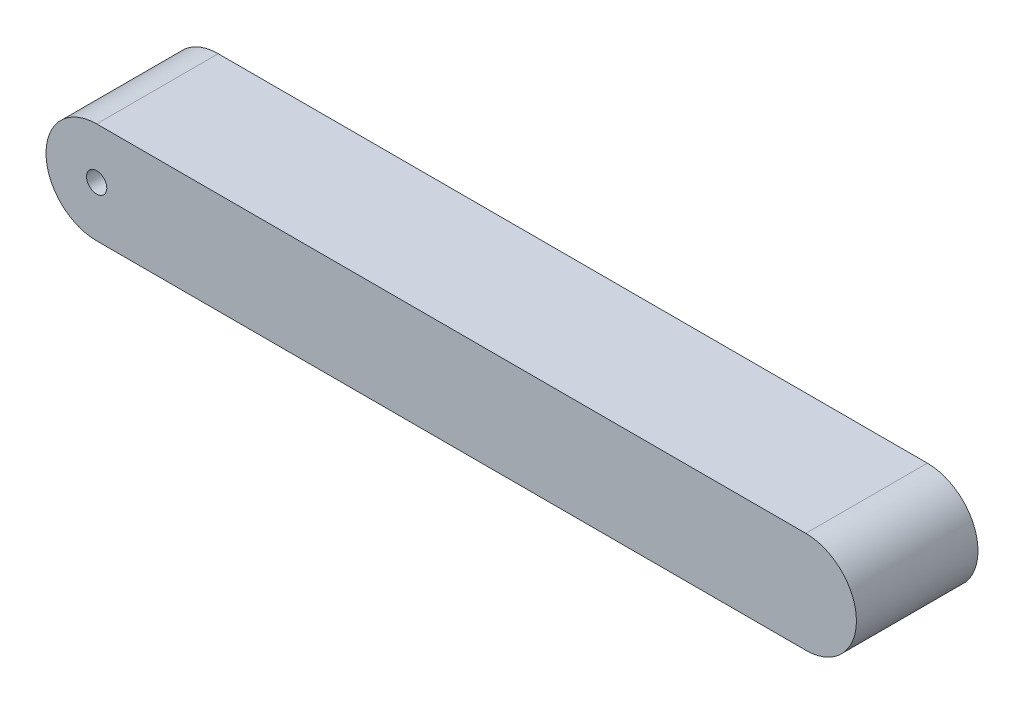
ISO-10303-21;
HEADER;
FILE_DESCRIPTION(('STEP AP214'),'2;1');
FILE_NAME('part.step','',(''),(''),'','','');
FILE_SCHEMA(('AUTOMOTIVE_DESIGN { 1 0 10303 214 1 1 1 1 }'));
ENDSEC;
DATA;
#1=APPLICATION_CONTEXT('core data for automotive mechanical design processes');
#2=APPLICATION_PROTOCOL_DEFINITION('international standard','automotive_design',2000,#1);
#3=PRODUCT_CONTEXT('',#1,'mechanical');
#4=PRODUCT('Part','Part','',(#3));
#5=PRODUCT_RELATED_PRODUCT_CATEGORY('part','',(#4));
#6=PRODUCT_DEFINITION_FORMATION('','',#4);
#7=PRODUCT_DEFINITION_CONTEXT('part definition',#1,'design');
#8=PRODUCT_DEFINITION('design','',#6,#7);
#9=PRODUCT_DEFINITION_SHAPE('','',#8);
#10=(LENGTH_UNIT() NAMED_UNIT(*) SI_UNIT(.MILLI.,.METRE.));
#11=(NAMED_UNIT(*) PLANE_ANGLE_UNIT() SI_UNIT($,.RADIAN.));
#12=(NAMED_UNIT(*) SI_UNIT($,.STERADIAN.) SOLID_ANGLE_UNIT());
#13=UNCERTAINTY_MEASURE_WITH_UNIT(LENGTH_MEASURE(1.E-05),#10,'distance_accuracy_value','');
#14=(GEOMETRIC_REPRESENTATION_CONTEXT(3) GLOBAL_UNCERTAINTY_ASSIGNED_CONTEXT((#13)) GLOBAL_UNIT_ASSIGNED_CONTEXT((#10,
#11,#12)) REPRESENTATION_CONTEXT('',''));
#15=CARTESIAN_POINT('',(0.,0.,0.));
#16=DIRECTION('',(0.,0.,1.));
#17=DIRECTION('',(1.,0.,0.));
#18=AXIS2_PLACEMENT_3D('',#15,#16,#17);
#19=CARTESIAN_POINT('',(0.,25.,60.));
#20=DIRECTION('',(0.,0.,-1.));
#21=DIRECTION('',(-1.,0.,0.));
#22=AXIS2_PLACEMENT_3D('',#19,#20,#21);
#23=CYLINDRICAL_SURFACE('',#22,25.);
#24=CARTESIAN_POINT('',(0.,25.,0.));
#25=DIRECTION('',(0.,0.,1.));
#26=DIRECTION('',(1.,0.,0.));
#27=AXIS2_PLACEMENT_3D('',#24,#25,#26);
#28=CIRCLE('',#27,25.);
#29=CARTESIAN_POINT('',(0.,50.,0.));
#30=VERTEX_POINT('',#29);
#31=CARTESIAN_POINT('',(0.,0.,0.));
#32=VERTEX_POINT('',#31);
#33=EDGE_CURVE('E106',#30,#32,#28,.T.);
#34=ORIENTED_EDGE('',*,*,#33,.T.);
#35=DIRECTION('',(0.,0.,-1.));
#36=VECTOR('',#35,1.);
#37=CARTESIAN_POINT('',(0.,0.,60.));
#38=LINE('',#37,#36);
#39=CARTESIAN_POINT('',(0.,0.,60.));
#40=VERTEX_POINT('',#39);
#41=EDGE_CURVE('E11',#40,#32,#38,.T.);
#42=ORIENTED_EDGE('',*,*,#41,.F.);
#43=CARTESIAN_POINT('',(0.,25.,60.));
#44=DIRECTION('',(0.,0.,1.));
#45=DIRECTION('',(1.,0.,0.));
#46=AXIS2_PLACEMENT_3D('',#43,#44,#45);
#47=CIRCLE('',#46,25.);
#48=CARTESIAN_POINT('',(0.,50.,60.));
#49=VERTEX_POINT('',#48);
#50=EDGE_CURVE('E89',#49,#40,#47,.T.);
#51=ORIENTED_EDGE('',*,*,#50,.F.);
#52=DIRECTION('',(0.,0.,-1.));
#53=VECTOR('',#52,1.);
#54=CARTESIAN_POINT('',(0.,50.,60.));
#55=LINE('',#54,#53);
#56=EDGE_CURVE('E55',#49,#30,#55,.T.);
#57=ORIENTED_EDGE('',*,*,#56,.T.);
#58=EDGE_LOOP('',(#34,#42,#51,#57));
#59=FACE_BOUND('',#58,.T.);
#60=ADVANCED_FACE('F39',(#59),#23,.T.);
#61=CARTESIAN_POINT('',(0.,0.,60.));
#62=DIRECTION('',(0.,1.,0.));
#63=DIRECTION('',(0.,0.,1.));
#64=AXIS2_PLACEMENT_3D('',#61,#62,#63);
#65=PLANE('',#64);
#66=DIRECTION('',(1.,0.,0.));
#67=VECTOR('',#66,1.);
#68=CARTESIAN_POINT('',(0.,0.,0.));
#69=LINE('',#68,#67);
#70=CARTESIAN_POINT('',(350.,0.,0.));
#71=VERTEX_POINT('',#70);
#72=EDGE_CURVE('E94',#32,#71,#69,.T.);
#73=ORIENTED_EDGE('',*,*,#72,.T.);
#74=DIRECTION('',(0.,0.,-1.));
#75=VECTOR('',#74,1.);
#76=CARTESIAN_POINT('',(350.,0.,60.));
#77=LINE('',#76,#75);
#78=CARTESIAN_POINT('',(350.,0.,60.));
#79=VERTEX_POINT('',#78);
#80=EDGE_CURVE('E47',#79,#71,#77,.T.);
#81=ORIENTED_EDGE('',*,*,#80,.F.);
#82=DIRECTION('',(1.,0.,0.));
#83=VECTOR('',#82,1.);
#84=CARTESIAN_POINT('',(0.,0.,60.));
#85=LINE('',#84,#83);
#86=EDGE_CURVE('E81',#40,#79,#85,.T.);
#87=ORIENTED_EDGE('',*,*,#86,.F.);
#88=ORIENTED_EDGE('',*,*,#41,.T.);
#89=EDGE_LOOP('',(#73,#81,#87,#88));
#90=FACE_BOUND('',#89,.T.);
#91=ADVANCED_FACE('F93',(#90),#65,.F.);
#92=CARTESIAN_POINT('',(350.,25.,60.));
#93=DIRECTION('',(0.,0.,-1.));
#94=DIRECTION('',(-1.,0.,0.));
#95=AXIS2_PLACEMENT_3D('',#92,#93,#94);
#96=CYLINDRICAL_SURFACE('',#95,25.);
#97=CARTESIAN_POINT('',(350.,25.,0.));
#98=DIRECTION('',(0.,0.,1.));
#99=DIRECTION('',(1.,0.,0.));
#100=AXIS2_PLACEMENT_3D('',#97,#98,#99);
#101=CIRCLE('',#100,25.);
#102=CARTESIAN_POINT('',(350.,50.0000000000001,0.));
#103=VERTEX_POINT('',#102);
#104=EDGE_CURVE('E109',#71,#103,#101,.T.);
#105=ORIENTED_EDGE('',*,*,#104,.T.);
#106=DIRECTION('',(0.,0.,-1.));
#107=VECTOR('',#106,1.);
#108=CARTESIAN_POINT('',(350.,50.0000000000001,60.));
#109=LINE('',#108,#107);
#110=CARTESIAN_POINT('',(350.,50.0000000000001,60.));
#111=VERTEX_POINT('',#110);
#112=EDGE_CURVE('E70',#111,#103,#109,.T.);
#113=ORIENTED_EDGE('',*,*,#112,.F.);
#114=CARTESIAN_POINT('',(350.,25.,60.));
#115=DIRECTION('',(0.,0.,1.));
#116=DIRECTION('',(1.,0.,0.));
#117=AXIS2_PLACEMENT_3D('',#114,#115,#116);
#118=CIRCLE('',#117,25.);
#119=EDGE_CURVE('E88',#79,#111,#118,.T.);
#120=ORIENTED_EDGE('',*,*,#119,.F.);
#121=ORIENTED_EDGE('',*,*,#80,.T.);
#122=EDGE_LOOP('',(#105,#113,#120,#121));
#123=FACE_BOUND('',#122,.T.);
#124=ADVANCED_FACE('F97',(#123),#96,.T.);
#125=CARTESIAN_POINT('',(0.,50.,60.));
#126=DIRECTION('',(0.,1.,0.));
#127=DIRECTION('',(-1.,0.,0.));
#128=AXIS2_PLACEMENT_3D('',#125,#126,#127);
#129=PLANE('',#128);
#130=DIRECTION('',(1.,0.,0.));
#131=VECTOR('',#130,1.);
#132=CARTESIAN_POINT('',(0.,50.,0.));
#133=LINE('',#132,#131);
#134=EDGE_CURVE('E111',#30,#103,#133,.T.);
#135=ORIENTED_EDGE('',*,*,#134,.F.);
#136=ORIENTED_EDGE('',*,*,#56,.F.);
#137=DIRECTION('',(1.,0.,0.));
#138=VECTOR('',#137,1.);
#139=CARTESIAN_POINT('',(0.,50.,60.));
#140=LINE('',#139,#138);
#141=EDGE_CURVE('E98',#49,#111,#140,.T.);
#142=ORIENTED_EDGE('',*,*,#141,.T.);
#143=ORIENTED_EDGE('',*,*,#112,.T.);
#144=EDGE_LOOP('',(#135,#136,#142,#143));
#145=FACE_BOUND('',#144,.T.);
#146=ADVANCED_FACE('F124',(#145),#129,.T.);
#147=CARTESIAN_POINT('',(0.,25.,60.));
#148=DIRECTION('',(0.,0.,-1.));
#149=DIRECTION('',(-1.,0.,0.));
#150=AXIS2_PLACEMENT_3D('',#147,#148,#149);
#151=CYLINDRICAL_SURFACE('',#150,5.);
#152=CARTESIAN_POINT('',(0.,25.,60.));
#153=DIRECTION('',(0.,0.,1.));
#154=DIRECTION('',(1.,0.,0.));
#155=AXIS2_PLACEMENT_3D('',#152,#153,#154);
#156=CIRCLE('',#155,5.);
#157=CARTESIAN_POINT('',(5.,25.,60.));
#158=VERTEX_POINT('',#157);
#159=EDGE_CURVE('E100',#158,#158,#156,.T.);
#160=ORIENTED_EDGE('',*,*,#159,.T.);
#161=EDGE_LOOP('',(#160));
#162=FACE_BOUND('',#161,.T.);
#163=CARTESIAN_POINT('',(0.,25.,0.));
#164=DIRECTION('',(0.,0.,1.));
#165=DIRECTION('',(1.,0.,0.));
#166=AXIS2_PLACEMENT_3D('',#163,#164,#165);
#167=CIRCLE('',#166,5.);
#168=CARTESIAN_POINT('',(5.,25.,0.));
#169=VERTEX_POINT('',#168);
#170=EDGE_CURVE('E114',#169,#169,#167,.T.);
#171=ORIENTED_EDGE('',*,*,#170,.F.);
#172=EDGE_LOOP('',(#171));
#173=FACE_BOUND('',#172,.T.);
#174=ADVANCED_FACE('F122',(#162,#173),#151,.F.);
#175=CARTESIAN_POINT('',(0.,0.,60.));
#176=DIRECTION('',(0.,0.,1.));
#177=DIRECTION('',(1.,0.,0.));
#178=AXIS2_PLACEMENT_3D('',#175,#176,#177);
#179=PLANE('',#178);
#180=ORIENTED_EDGE('',*,*,#50,.T.);
#181=ORIENTED_EDGE('',*,*,#86,.T.);
#182=ORIENTED_EDGE('',*,*,#119,.T.);
#183=ORIENTED_EDGE('',*,*,#141,.F.);
#184=EDGE_LOOP('',(#180,#181,#182,#183));
#185=FACE_BOUND('',#184,.T.);
#186=ORIENTED_EDGE('',*,*,#159,.F.);
#187=EDGE_LOOP('',(#186));
#188=FACE_BOUND('',#187,.T.);
#189=ADVANCED_FACE('F84',(#185,#188),#179,.T.);
#190=CARTESIAN_POINT('',(0.,0.,0.));
#191=DIRECTION('',(0.,0.,1.));
#192=DIRECTION('',(1.,0.,0.));
#193=AXIS2_PLACEMENT_3D('',#190,#191,#192);
#194=PLANE('',#193);
#195=ORIENTED_EDGE('',*,*,#33,.F.);
#196=ORIENTED_EDGE('',*,*,#134,.T.);
#197=ORIENTED_EDGE('',*,*,#104,.F.);
#198=ORIENTED_EDGE('',*,*,#72,.F.);
#199=EDGE_LOOP('',(#195,#196,#197,#198));
#200=FACE_BOUND('',#199,.T.);
#201=ORIENTED_EDGE('',*,*,#170,.T.);
#202=EDGE_LOOP('',(#201));
#203=FACE_BOUND('',#202,.T.);
#204=ADVANCED_FACE('F120',(#200,#203),#194,.F.);
#205=CLOSED_SHELL('',(#60,#91,#124,#146,#174,#189,#204));
#206=MANIFOLD_SOLID_BREP('B2',#205);
#207=ADVANCED_BREP_SHAPE_REPRESENTATION('',(#18,#206),#14);
#208=SHAPE_DEFINITION_REPRESENTATION(#9,#207);
ENDSEC;
END-ISO-10303-21;
